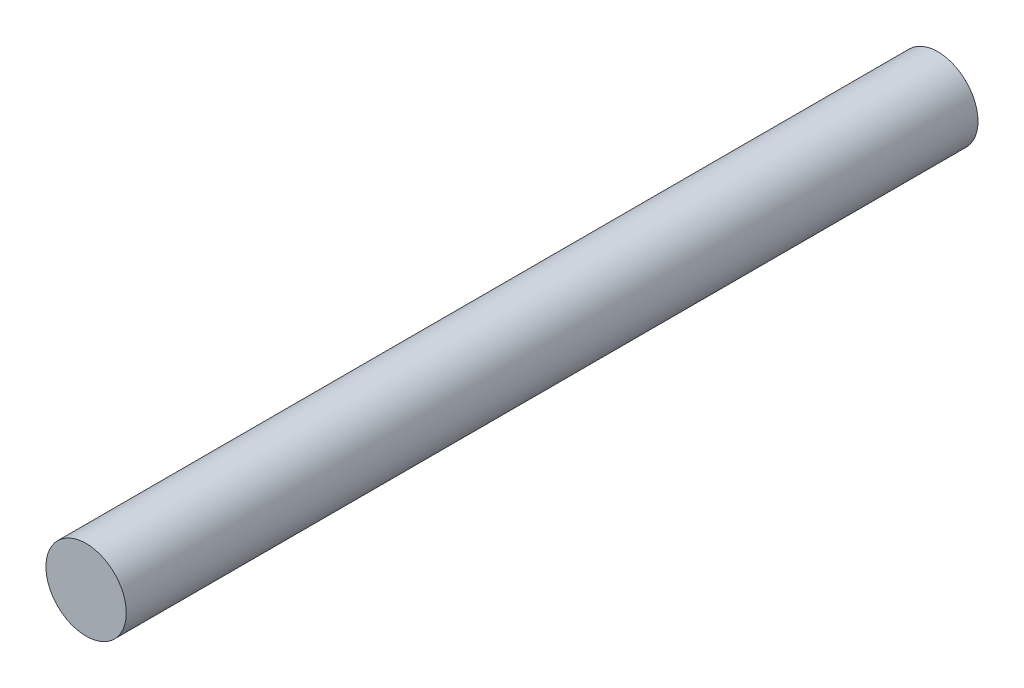
ISO-10303-21;
HEADER;
FILE_DESCRIPTION(('STEP AP214'),'2;1');
FILE_NAME('part.step','',(''),(''),'','','');
FILE_SCHEMA(('AUTOMOTIVE_DESIGN { 1 0 10303 214 1 1 1 1 }'));
ENDSEC;
DATA;
#1=APPLICATION_CONTEXT('core data for automotive mechanical design processes');
#2=APPLICATION_PROTOCOL_DEFINITION('international standard','automotive_design',2000,#1);
#3=PRODUCT_CONTEXT('',#1,'mechanical');
#4=PRODUCT('Part','Part','',(#3));
#5=PRODUCT_RELATED_PRODUCT_CATEGORY('part','',(#4));
#6=PRODUCT_DEFINITION_FORMATION('','',#4);
#7=PRODUCT_DEFINITION_CONTEXT('part definition',#1,'design');
#8=PRODUCT_DEFINITION('design','',#6,#7);
#9=PRODUCT_DEFINITION_SHAPE('','',#8);
#10=(LENGTH_UNIT() NAMED_UNIT(*) SI_UNIT(.MILLI.,.METRE.));
#11=(NAMED_UNIT(*) PLANE_ANGLE_UNIT() SI_UNIT($,.RADIAN.));
#12=(NAMED_UNIT(*) SI_UNIT($,.STERADIAN.) SOLID_ANGLE_UNIT());
#13=UNCERTAINTY_MEASURE_WITH_UNIT(LENGTH_MEASURE(1.E-05),#10,'distance_accuracy_value','');
#14=(GEOMETRIC_REPRESENTATION_CONTEXT(3) GLOBAL_UNCERTAINTY_ASSIGNED_CONTEXT((#13)) GLOBAL_UNIT_ASSIGNED_CONTEXT((#10,
#11,#12)) REPRESENTATION_CONTEXT('',''));
#15=CARTESIAN_POINT('',(0.,0.,0.));
#16=DIRECTION('',(0.,0.,1.));
#17=DIRECTION('',(1.,0.,0.));
#18=AXIS2_PLACEMENT_3D('',#15,#16,#17);
#19=CARTESIAN_POINT('',(0.,0.,26.5));
#20=DIRECTION('',(0.,0.,-1.));
#21=DIRECTION('',(-1.,0.,0.));
#22=AXIS2_PLACEMENT_3D('',#19,#20,#21);
#23=CYLINDRICAL_SURFACE('',#22,2.5);
#24=CARTESIAN_POINT('',(0.,0.,26.5));
#25=DIRECTION('',(0.,0.,1.));
#26=DIRECTION('',(1.,0.,0.));
#27=AXIS2_PLACEMENT_3D('',#24,#25,#26);
#28=CIRCLE('',#27,2.5);
#29=CARTESIAN_POINT('',(2.5,0.,26.5));
#30=VERTEX_POINT('',#29);
#31=EDGE_CURVE('E10',#30,#30,#28,.T.);
#32=ORIENTED_EDGE('',*,*,#31,.F.);
#33=EDGE_LOOP('',(#32));
#34=FACE_BOUND('',#33,.T.);
#35=CARTESIAN_POINT('',(0.,0.,-26.5));
#36=DIRECTION('',(0.,0.,1.));
#37=DIRECTION('',(1.,0.,0.));
#38=AXIS2_PLACEMENT_3D('',#35,#36,#37);
#39=CIRCLE('',#38,2.5);
#40=CARTESIAN_POINT('',(2.5,0.,-26.5));
#41=VERTEX_POINT('',#40);
#42=EDGE_CURVE('E34',#41,#41,#39,.T.);
#43=ORIENTED_EDGE('',*,*,#42,.T.);
#44=EDGE_LOOP('',(#43));
#45=FACE_BOUND('',#44,.T.);
#46=ADVANCED_FACE('F31',(#34,#45),#23,.T.);
#47=CARTESIAN_POINT('',(0.,0.,26.5));
#48=DIRECTION('',(0.,0.,1.));
#49=DIRECTION('',(1.,0.,0.));
#50=AXIS2_PLACEMENT_3D('',#47,#48,#49);
#51=PLANE('',#50);
#52=ORIENTED_EDGE('',*,*,#31,.T.);
#53=EDGE_LOOP('',(#52));
#54=FACE_BOUND('',#53,.T.);
#55=ADVANCED_FACE('F46',(#54),#51,.T.);
#56=CARTESIAN_POINT('',(0.,0.,-26.5));
#57=DIRECTION('',(0.,0.,1.));
#58=DIRECTION('',(1.,0.,0.));
#59=AXIS2_PLACEMENT_3D('',#56,#57,#58);
#60=PLANE('',#59);
#61=ORIENTED_EDGE('',*,*,#42,.F.);
#62=EDGE_LOOP('',(#61));
#63=FACE_BOUND('',#62,.T.);
#64=ADVANCED_FACE('F44',(#63),#60,.F.);
#65=CLOSED_SHELL('',(#46,#55,#64));
#66=MANIFOLD_SOLID_BREP('B2',#65);
#67=ADVANCED_BREP_SHAPE_REPRESENTATION('',(#18,#66),#14);
#68=SHAPE_DEFINITION_REPRESENTATION(#9,#67);
ENDSEC;
END-ISO-10303-21;
